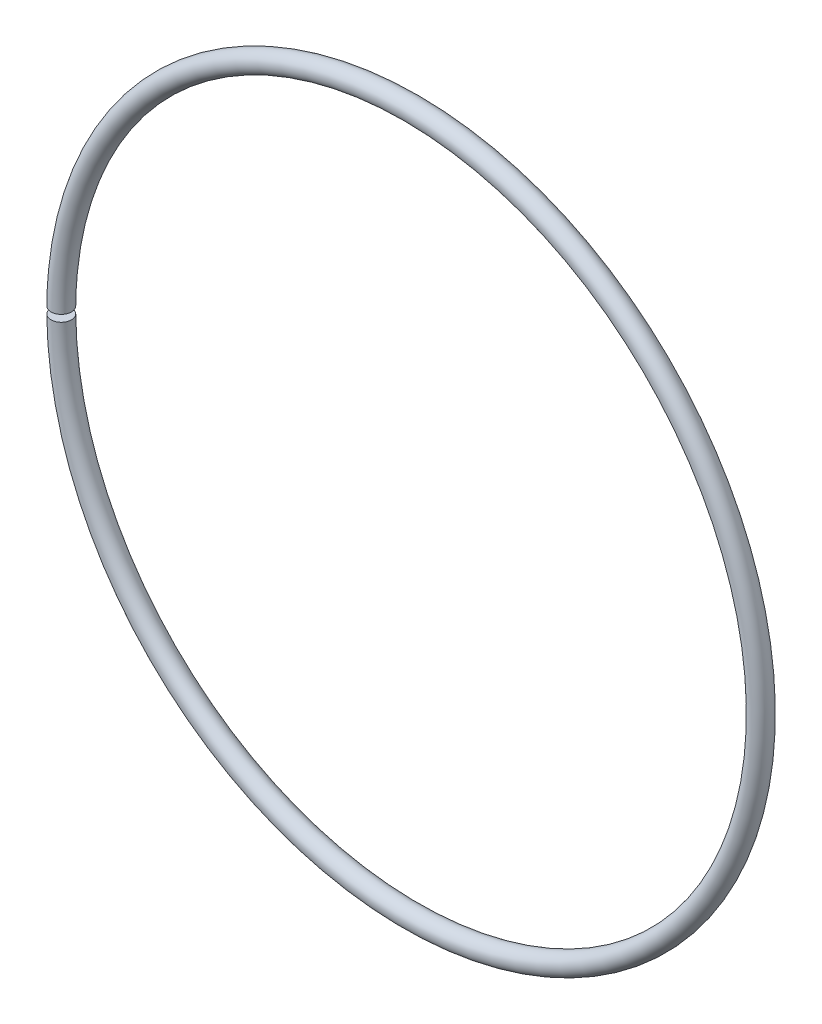
ISO-10303-21;
HEADER;
FILE_DESCRIPTION(('STEP AP214'),'2;1');
FILE_NAME('part.step','',(''),(''),'','','');
FILE_SCHEMA(('AUTOMOTIVE_DESIGN { 1 0 10303 214 1 1 1 1 }'));
ENDSEC;
DATA;
#1=APPLICATION_CONTEXT('core data for automotive mechanical design processes');
#2=APPLICATION_PROTOCOL_DEFINITION('international standard','automotive_design',2000,#1);
#3=PRODUCT_CONTEXT('',#1,'mechanical');
#4=PRODUCT('Part','Part','',(#3));
#5=PRODUCT_RELATED_PRODUCT_CATEGORY('part','',(#4));
#6=PRODUCT_DEFINITION_FORMATION('','',#4);
#7=PRODUCT_DEFINITION_CONTEXT('part definition',#1,'design');
#8=PRODUCT_DEFINITION('design','',#6,#7);
#9=PRODUCT_DEFINITION_SHAPE('','',#8);
#10=(LENGTH_UNIT() NAMED_UNIT(*) SI_UNIT(.MILLI.,.METRE.));
#11=(NAMED_UNIT(*) PLANE_ANGLE_UNIT() SI_UNIT($,.RADIAN.));
#12=(NAMED_UNIT(*) SI_UNIT($,.STERADIAN.) SOLID_ANGLE_UNIT());
#13=UNCERTAINTY_MEASURE_WITH_UNIT(LENGTH_MEASURE(1.E-05),#10,'distance_accuracy_value','');
#14=(GEOMETRIC_REPRESENTATION_CONTEXT(3) GLOBAL_UNCERTAINTY_ASSIGNED_CONTEXT((#13)) GLOBAL_UNIT_ASSIGNED_CONTEXT((#10,
#11,#12)) REPRESENTATION_CONTEXT('',''));
#15=CARTESIAN_POINT('',(0.,0.,0.));
#16=DIRECTION('',(0.,0.,1.));
#17=DIRECTION('',(1.,0.,0.));
#18=AXIS2_PLACEMENT_3D('',#15,#16,#17);
#19=CARTESIAN_POINT('',(0.,0.,0.));
#20=DIRECTION('',(0.,0.,1.));
#21=DIRECTION('',(1.,0.,0.));
#22=AXIS2_PLACEMENT_3D('',#19,#20,#21);
#23=TOROIDAL_SURFACE('',#22,25.6,0.750000000000002);
#24=CARTESIAN_POINT('',(-26.2167942102881,0.249999999999999,-0.42496246554653));
#25=CARTESIAN_POINT('',(-26.2406630792447,0.249999999999999,-0.39025031500536));
#26=CARTESIAN_POINT('',(-26.2616179850022,0.249999999999999,-0.353497204346818));
#27=CARTESIAN_POINT('',(-26.2970765777243,0.249999999999999,-0.276963606314066));
#28=CARTESIAN_POINT('',(-26.3115724677877,0.249999999999999,-0.23717952759191));
#29=CARTESIAN_POINT('',(-26.33367213117,0.249999999999999,-0.155757411144962));
#30=CARTESIAN_POINT('',(-26.3412791827037,0.249999999999999,-0.114120265152987));
#31=CARTESIAN_POINT('',(-26.3493923907091,0.249999999999999,-0.0301712546822898));
#32=CARTESIAN_POINT('',(-26.3499003107926,0.249999999999999,0.0121404396057906));
#33=CARTESIAN_POINT('',(-26.3438060602631,0.249999999999999,0.0962526855030376));
#34=CARTESIAN_POINT('',(-26.3372032574999,0.249999999999999,0.138053191332909));
#35=CARTESIAN_POINT('',(-26.3170733840942,0.249999999999999,0.219953978378283));
#36=CARTESIAN_POINT('',(-26.3035460418657,0.249999999999999,0.260054192840178));
#37=CARTESIAN_POINT('',(-26.2699513401977,0.249999999999999,0.337413895099842));
#38=CARTESIAN_POINT('',(-26.2498840690265,0.249999999999999,0.374673421229478));
#39=CARTESIAN_POINT('',(-26.2037792318961,0.249999999999999,0.445294679405719));
#40=CARTESIAN_POINT('',(-26.1777416771368,0.249999999999999,0.478656418764171));
#41=CARTESIAN_POINT('',(-26.1204345024846,0.249999999999999,0.540536347480944));
#42=CARTESIAN_POINT('',(-26.0891647111092,0.249999999999999,0.569054378028779));
#43=CARTESIAN_POINT('',(-26.0222814274427,0.249999999999999,0.620436144141461));
#44=CARTESIAN_POINT('',(-25.9866679419643,0.249999999999999,0.643299888574333));
#45=CARTESIAN_POINT('',(-25.9121064864148,0.249999999999999,0.682725198156121));
#46=CARTESIAN_POINT('',(-25.8731583677059,0.249999999999999,0.69928648220006));
#47=CARTESIAN_POINT('',(-25.793034566734,0.249999999999999,0.7256354646567));
#48=CARTESIAN_POINT('',(-25.7518588815916,0.249999999999999,0.735423154313419));
#49=CARTESIAN_POINT('',(-25.6684471246097,0.249999999999999,0.747947425013548));
#50=CARTESIAN_POINT('',(-25.6262110115794,0.249999999999999,0.750683731727433));
#51=CARTESIAN_POINT('',(-25.541878878546,0.249999999999999,0.749026800942901));
#52=CARTESIAN_POINT('',(-25.4997828585056,0.249999999999999,0.744633565337315));
#53=CARTESIAN_POINT('',(-25.4169251241615,0.249999999999999,0.7288420980993));
#54=CARTESIAN_POINT('',(-25.3761634327789,0.249999999999999,0.717443746199826));
#55=CARTESIAN_POINT('',(-25.2971322544354,0.249999999999999,0.687965428706587));
#56=CARTESIAN_POINT('',(-25.2588627677344,0.249999999999999,0.669885462416547));
#57=CARTESIAN_POINT('',(-25.1859029692199,0.249999999999999,0.627557350684801));
#58=CARTESIAN_POINT('',(-25.1512126081154,0.249999999999999,0.603309290204828));
#59=CARTESIAN_POINT('',(-25.0863953736119,0.249999999999999,0.54933310659567));
#60=CARTESIAN_POINT('',(-25.0562684991471,0.249999999999999,0.519604984746403));
#61=CARTESIAN_POINT('',(-25.0014347536852,0.249999999999999,0.455513809938692));
#62=CARTESIAN_POINT('',(-24.9767276676994,0.249999999999999,0.421150940915898));
#63=CARTESIAN_POINT('',(-24.9334335378204,0.249999999999999,0.348764802877425));
#64=CARTESIAN_POINT('',(-24.9148464925504,0.249999999999999,0.310741534685224));
#65=CARTESIAN_POINT('',(-24.8843210076945,0.249999999999999,0.232115941492679));
#66=CARTESIAN_POINT('',(-24.8723822468997,0.249999999999999,0.191513741197855));
#67=CARTESIAN_POINT('',(-24.8554909742659,0.249999999999999,0.10888125768364));
#68=CARTESIAN_POINT('',(-24.8505384599296,0.249999999999999,0.0668509749747317));
#69=CARTESIAN_POINT('',(-24.8477603639987,0.249999999999999,-0.0174429971488711));
#70=CARTESIAN_POINT('',(-24.8499345338899,0.249999999999999,-0.059706678373435));
#71=CARTESIAN_POINT('',(-24.8613475218187,0.249999999999999,-0.143269162130858));
#72=CARTESIAN_POINT('',(-24.8705863421823,0.249999999999999,-0.184567964346025));
#73=CARTESIAN_POINT('',(-24.8958662378044,0.249999999999999,-0.265028164109609));
#74=CARTESIAN_POINT('',(-24.9119072841248,0.249999999999999,-0.304189570750183));
#75=CARTESIAN_POINT('',(-24.9503361435673,0.249999999999999,-0.379263545879553));
#76=CARTESIAN_POINT('',(-24.972723950695,0.249999999999999,-0.415176117436842));
#77=CARTESIAN_POINT('',(-25.0232114196672,0.249999999999999,-0.482734111378493));
#78=CARTESIAN_POINT('',(-25.0513112380102,0.249999999999999,-0.514379416808265));
#79=CARTESIAN_POINT('',(-25.1124246609958,0.249999999999999,-0.572503642354306));
#80=CARTESIAN_POINT('',(-25.1454382756856,0.249999999999999,-0.598982551906676));
#81=CARTESIAN_POINT('',(-25.215443676041,0.249999999999999,-0.646023537621336));
#82=CARTESIAN_POINT('',(-25.2524356404259,0.249999999999999,-0.666585347817394));
#83=CARTESIAN_POINT('',(-25.3293465223396,0.249999999999999,-0.701207056164363));
#84=CARTESIAN_POINT('',(-25.369265446511,0.249999999999999,-0.7152669395589));
#85=CARTESIAN_POINT('',(-25.4508996380002,0.249999999999999,-0.736486437144622));
#86=CARTESIAN_POINT('',(-25.4926150178072,0.249999999999999,-0.743645618573701));
#87=CARTESIAN_POINT('',(-25.5766540166075,0.249999999999999,-0.750858773331705));
#88=CARTESIAN_POINT('',(-25.618977611757,0.249999999999999,-0.750913024438314));
#89=CARTESIAN_POINT('',(-25.7030295470313,0.249999999999999,-0.743916067326286));
#90=CARTESIAN_POINT('',(-25.744757936193,0.249999999999999,-0.736865447921732));
#91=CARTESIAN_POINT('',(-25.8264499200809,0.249999999999999,-0.715855930468152));
#92=CARTESIAN_POINT('',(-25.8664130736177,0.249999999999999,-0.701895315911019));
#93=CARTESIAN_POINT('',(-25.9434432504845,0.249999999999999,-0.667457359928194));
#94=CARTESIAN_POINT('',(-25.9805089084742,0.249999999999999,-0.646976969075092));
#95=CARTESIAN_POINT('',(-26.0506408001677,0.249999999999999,-0.600095991942964));
#96=CARTESIAN_POINT('',(-26.0837117918424,0.249999999999999,-0.57370255776435));
#97=CARTESIAN_POINT('',(-26.1334400747895,0.249999999999999,-0.52664930732811));
#98=CARTESIAN_POINT('',(-26.1516013950916,0.249999999999999,-0.507551799661643));
#99=CARTESIAN_POINT('',(-26.1858193154409,0.249999999999999,-0.46755610881789));
#100=CARTESIAN_POINT('',(-26.2018759155059,0.249999999999999,-0.446657925655766));
#101=CARTESIAN_POINT('',(-26.2167942102881,0.249999999999999,-0.42496246554653));
#102=B_SPLINE_CURVE_WITH_KNOTS('',3,(#24,#25,#26,#27,#28,#29,#30,#31,#32,#33,#34,#35,#36,#37,
#38,#39,#40,#41,#42,#43,#44,#45,#46,#47,#48,#49,#50,#51,#52,#53,#54,#55,#56,#57,#58,#59,#60,#61,
#62,#63,#64,#65,#66,#67,#68,#69,#70,#71,#72,#73,#74,#75,#76,#77,#78,#79,#80,#81,#82,#83,#84,#85,
#86,#87,#88,#89,#90,#91,#92,#93,#94,#95,#96,#97,#98,#99,#100,#101),.UNSPECIFIED.,.T.,.F.,(4,2,2,
2,2,2,2,2,2,2,2,2,2,2,2,2,2,2,2,2,2,2,2,2,2,2,2,2,2,2,2,2,2,2,2,2,2,2,4),(0.,0.126283909751693,
0.25271985090468,0.379095592896567,0.505439939255911,0.63179551867817,0.758156054248315,
0.884514884424491,1.0108734775607,1.13723621281161,1.26359874987746,1.38996692235772,
1.51633525818928,1.64270851022558,1.76908172871089,1.89545711689009,2.02183251823856,
2.14820617893723,2.27457981012024,2.40094842748495,2.52731701642065,2.65367949938681,
2.78004193718393,2.90639996865126,3.03275804172204,3.15911557724286,3.28547299341898,
3.41183387201746,3.53819500898742,3.66456182484596,3.79092892749746,3.91730395446396,
4.0436740406117,4.17003365473643,4.29642467354884,4.42287489499276,4.54917298695106,
4.62810176280651,4.7070305379974),.UNSPECIFIED.);
#103=CARTESIAN_POINT('',(-26.2167942102881,0.249999999999999,-0.42496246554653));
#104=VERTEX_POINT('',#103);
#105=EDGE_CURVE('E43',#104,#104,#102,.T.);
#106=ORIENTED_EDGE('',*,*,#105,.T.);
#107=EDGE_LOOP('',(#106));
#108=FACE_BOUND('',#107,.T.);
#109=CARTESIAN_POINT('',(-26.2167942102881,-0.250000000000002,-0.42496246554653));
#110=CARTESIAN_POINT('',(-26.1929208417514,-0.250000000000002,-0.459674564892452));
#111=CARTESIAN_POINT('',(-26.1660985418281,-0.250000000000002,-0.49239580281975));
#112=CARTESIAN_POINT('',(-26.1073180865053,-0.250000000000002,-0.552897210982558));
#113=CARTESIAN_POINT('',(-26.0753537818834,-0.250000000000002,-0.580671380250814));
#114=CARTESIAN_POINT('',(-26.0072276083036,-0.250000000000002,-0.630447101462603));
#115=CARTESIAN_POINT('',(-25.971067758157,-0.250000000000002,-0.65245141326434));
#116=CARTESIAN_POINT('',(-25.8955769508532,-0.250000000000002,-0.690070778534223));
#117=CARTESIAN_POINT('',(-25.85624678387,-0.250000000000002,-0.705687418216351));
#118=CARTESIAN_POINT('',(-25.7755174292009,-0.250000000000002,-0.730099215818039));
#119=CARTESIAN_POINT('',(-25.7341179603397,-0.250000000000002,-0.738893444016599));
#120=CARTESIAN_POINT('',(-25.6504286187865,-0.250000000000002,-0.74940719560736));
#121=CARTESIAN_POINT('',(-25.6081387110221,-0.250000000000002,-0.751126439806397));
#122=CARTESIAN_POINT('',(-25.5238700682956,-0.250000000000002,-0.747440755802959));
#123=CARTESIAN_POINT('',(-25.4818913363327,-0.250000000000002,-0.742035759023005));
#124=CARTESIAN_POINT('',(-25.3994372029838,-0.250000000000002,-0.724254862113512));
#125=CARTESIAN_POINT('',(-25.3589617986507,-0.250000000000002,-0.71187897565069));
#126=CARTESIAN_POINT('',(-25.2806631786184,-0.250000000000002,-0.68050752188526));
#127=CARTESIAN_POINT('',(-25.2428399671775,-0.250000000000002,-0.661511943954789));
#128=CARTESIAN_POINT('',(-25.170919671782,-0.250000000000002,-0.61744027900543));
#129=CARTESIAN_POINT('',(-25.1368225806436,-0.250000000000002,-0.592364203709938));
#130=CARTESIAN_POINT('',(-25.0733234840513,-0.250000000000002,-0.536844112963645));
#131=CARTESIAN_POINT('',(-25.0439213393242,-0.250000000000002,-0.506400256801668));
#132=CARTESIAN_POINT('',(-24.9906457192794,-0.250000000000002,-0.441008214563031));
#133=CARTESIAN_POINT('',(-24.9667722484245,-0.250000000000002,-0.406060024850425));
#134=CARTESIAN_POINT('',(-24.9252329258295,-0.250000000000002,-0.332653197497288));
#135=CARTESIAN_POINT('',(-24.907566778447,-0.250000000000002,-0.294194727154306));
#136=CARTESIAN_POINT('',(-24.8789421813588,-0.250000000000002,-0.214857684982341));
#137=CARTESIAN_POINT('',(-24.8679837271858,-0.250000000000002,-0.17397911476515));
#138=CARTESIAN_POINT('',(-24.8530860235451,-0.250000000000002,-0.0909641703302233));
#139=CARTESIAN_POINT('',(-24.8491464719118,-0.250000000000002,-0.0488278503383584));
#140=CARTESIAN_POINT('',(-24.8483975165384,-0.250000000000002,0.0355081119897473));
#141=CARTESIAN_POINT('',(-24.8515881126619,-0.250000000000002,0.0777077543247764));
#142=CARTESIAN_POINT('',(-24.8650087224774,-0.250000000000002,0.16097160448671));
#143=CARTESIAN_POINT('',(-24.8752386039807,-0.250000000000002,0.202035833620142));
#144=CARTESIAN_POINT('',(-24.9024471663326,-0.250000000000002,0.281864030671791));
#145=CARTESIAN_POINT('',(-24.9194258470981,-0.250000000000002,0.320627998618305));
#146=CARTESIAN_POINT('',(-24.9596502274686,-0.250000000000002,0.39475593212373));
#147=CARTESIAN_POINT('',(-24.982896019247,-0.250000000000002,0.430119847666107));
#148=CARTESIAN_POINT('',(-25.0349945312615,-0.250000000000002,0.496443312486731));
#149=CARTESIAN_POINT('',(-25.0638472528607,-0.250000000000002,0.527402860694268));
#150=CARTESIAN_POINT('',(-25.1263418280963,-0.250000000000002,0.584040121401487));
#151=CARTESIAN_POINT('',(-25.1599838786297,-0.250000000000002,0.609717616641427));
#152=CARTESIAN_POINT('',(-25.2311011887622,-0.250000000000002,0.655060452704956));
#153=CARTESIAN_POINT('',(-25.2685764488873,-0.250000000000002,0.674725792703538));
#154=CARTESIAN_POINT('',(-25.3462983006317,-0.250000000000002,0.707487055383701));
#155=CARTESIAN_POINT('',(-25.3865450249398,-0.250000000000002,0.720582663278502));
#156=CARTESIAN_POINT('',(-25.468665776327,-0.250000000000002,0.739831415442062));
#157=CARTESIAN_POINT('',(-25.5105398044143,-0.250000000000002,0.745984555409965));
#158=CARTESIAN_POINT('',(-25.5947279662902,-0.250000000000002,0.751173829162334));
#159=CARTESIAN_POINT('',(-25.6370421147681,-0.250000000000002,0.750209724639548));
#160=CARTESIAN_POINT('',(-25.7209079311125,-0.250000000000002,0.741191297593638));
#161=CARTESIAN_POINT('',(-25.7624595997308,-0.250000000000002,0.733136982062787));
#162=CARTESIAN_POINT('',(-25.8436211211443,-0.250000000000002,0.710166663749213));
#163=CARTESIAN_POINT('',(-25.8832309663603,-0.250000000000002,0.69525063418698));
#164=CARTESIAN_POINT('',(-25.9593842475597,-0.250000000000002,0.658980169694848));
#165=CARTESIAN_POINT('',(-25.9959276783164,-0.250000000000002,0.637625723791069));
#166=CARTESIAN_POINT('',(-26.0649096048778,-0.250000000000002,0.589085203046373));
#167=CARTESIAN_POINT('',(-26.0973482118162,-0.250000000000002,0.561899286139932));
#168=CARTESIAN_POINT('',(-26.1572007005145,-0.250000000000002,0.502467067890262));
#169=CARTESIAN_POINT('',(-26.1846145732634,-0.250000000000002,0.470220757472226));
#170=CARTESIAN_POINT('',(-26.2336385273832,-0.250000000000002,0.401584023577297));
#171=CARTESIAN_POINT('',(-26.255248748785,-0.250000000000002,0.365193700117607));
#172=CARTESIAN_POINT('',(-26.2920518561016,-0.250000000000002,0.289302766368554));
#173=CARTESIAN_POINT('',(-26.3072449955061,-0.250000000000002,0.249802279011014));
#174=CARTESIAN_POINT('',(-26.3307822190554,-0.250000000000002,0.168817420419003));
#175=CARTESIAN_POINT('',(-26.3391273069669,-0.250000000000002,0.127333340877159));
#176=CARTESIAN_POINT('',(-26.3487357591098,-0.250000000000002,0.043541547142575));
#177=CARTESIAN_POINT('',(-26.3499973636987,-0.250000000000002,0.00123363091556807));
#178=CARTESIAN_POINT('',(-26.3453998496654,-0.250000000000002,-0.0830087739169241));
#179=CARTESIAN_POINT('',(-26.3395375010651,-0.250000000000002,-0.124943084444635));
#180=CARTESIAN_POINT('',(-26.3208547206936,-0.250000000000002,-0.207195471483756));
#181=CARTESIAN_POINT('',(-26.3080426684095,-0.250000000000002,-0.247515431730228));
#182=CARTESIAN_POINT('',(-26.2819021154301,-0.250000000000002,-0.310774997311077));
#183=CARTESIAN_POINT('',(-26.2705706677605,-0.250000000000002,-0.334560094293044));
#184=CARTESIAN_POINT('',(-26.2454745968854,-0.250000000000002,-0.380809999204857));
#185=CARTESIAN_POINT('',(-26.2317099737069,-0.250000000000002,-0.403274807149314));
#186=CARTESIAN_POINT('',(-26.2167942102881,-0.250000000000002,-0.42496246554653));
#187=B_SPLINE_CURVE_WITH_KNOTS('',3,(#109,#110,#111,#112,#113,#114,#115,#116,#117,#118,#119,
#120,#121,#122,#123,#124,#125,#126,#127,#128,#129,#130,#131,#132,#133,#134,#135,#136,#137,#138,
#139,#140,#141,#142,#143,#144,#145,#146,#147,#148,#149,#150,#151,#152,#153,#154,#155,#156,#157,
#158,#159,#160,#161,#162,#163,#164,#165,#166,#167,#168,#169,#170,#171,#172,#173,#174,#175,#176,
#177,#178,#179,#180,#181,#182,#183,#184,#185,#186),.UNSPECIFIED.,.T.,.F.,(4,2,2,2,2,2,2,2,2,2,2,
2,2,2,2,2,2,2,2,2,2,2,2,2,2,2,2,2,2,2,2,2,2,2,2,2,2,2,4),(0.,0.12629145142369,0.252735070678096,
0.37911809819773,0.505469722663667,0.631838562616212,0.758212389290685,0.884587432440263,
1.01096222782721,1.13733722610882,1.26371198073729,1.39008298582764,1.51645409292666,
1.6428191804077,1.76918418373022,1.89554374687424,2.02190330760071,2.14826049552287,
2.27461768189059,2.40097672675372,2.52733580233489,2.65370007423903,2.78006436348326,
2.90643470685706,3.03280512851719,3.15917978146718,3.28555430978828,3.41192933132097,
3.53830456825327,3.66467638298089,3.79104842433377,3.91741741629943,4.0437814159302,
4.17012689019814,4.29650374916851,4.42293792839387,4.54921999952113,4.62812522101129,
4.70703044162819),.UNSPECIFIED.);
#188=CARTESIAN_POINT('',(-26.2167942102881,-0.250000000000002,-0.42496246554653));
#189=VERTEX_POINT('',#188);
#190=EDGE_CURVE('E10',#189,#189,#187,.T.);
#191=ORIENTED_EDGE('',*,*,#190,.T.);
#192=EDGE_LOOP('',(#191));
#193=FACE_BOUND('',#192,.T.);
#194=ADVANCED_FACE('F32',(#108,#193),#23,.T.);
#195=CARTESIAN_POINT('',(0.,0.250000000000002,-0.750000000000002));
#196=DIRECTION('',(0.,1.,0.));
#197=DIRECTION('',(-1.,0.,0.));
#198=AXIS2_PLACEMENT_3D('',#195,#196,#197);
#199=PLANE('',#198);
#200=ORIENTED_EDGE('',*,*,#105,.F.);
#201=EDGE_LOOP('',(#200));
#202=FACE_BOUND('',#201,.T.);
#203=ADVANCED_FACE('F52',(#202),#199,.F.);
#204=CARTESIAN_POINT('',(-28.,-0.250000000000002,-0.750000000000002));
#205=DIRECTION('',(0.,-1.,0.));
#206=DIRECTION('',(0.,0.,-1.));
#207=AXIS2_PLACEMENT_3D('',#204,#205,#206);
#208=PLANE('',#207);
#209=ORIENTED_EDGE('',*,*,#190,.F.);
#210=EDGE_LOOP('',(#209));
#211=FACE_BOUND('',#210,.T.);
#212=ADVANCED_FACE('F55',(#211),#208,.F.);
#213=CLOSED_SHELL('',(#194,#203,#212));
#214=MANIFOLD_SOLID_BREP('B2',#213);
#215=ADVANCED_BREP_SHAPE_REPRESENTATION('',(#18,#214),#14);
#216=SHAPE_DEFINITION_REPRESENTATION(#9,#215);
ENDSEC;
END-ISO-10303-21;
